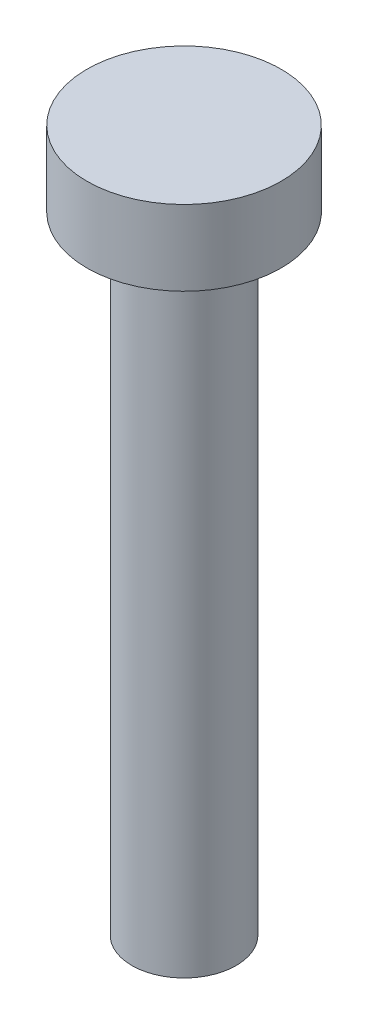
ISO-10303-21;
HEADER;
FILE_DESCRIPTION(('STEP AP214'),'2;1');
FILE_NAME('part.step','',(''),(''),'','','');
FILE_SCHEMA(('AUTOMOTIVE_DESIGN { 1 0 10303 214 1 1 1 1 }'));
ENDSEC;
DATA;
#1=APPLICATION_CONTEXT('core data for automotive mechanical design processes');
#2=APPLICATION_PROTOCOL_DEFINITION('international standard','automotive_design',2000,#1);
#3=PRODUCT_CONTEXT('',#1,'mechanical');
#4=PRODUCT('Part','Part','',(#3));
#5=PRODUCT_RELATED_PRODUCT_CATEGORY('part','',(#4));
#6=PRODUCT_DEFINITION_FORMATION('','',#4);
#7=PRODUCT_DEFINITION_CONTEXT('part definition',#1,'design');
#8=PRODUCT_DEFINITION('design','',#6,#7);
#9=PRODUCT_DEFINITION_SHAPE('','',#8);
#10=(LENGTH_UNIT() NAMED_UNIT(*) SI_UNIT(.MILLI.,.METRE.));
#11=(NAMED_UNIT(*) PLANE_ANGLE_UNIT() SI_UNIT($,.RADIAN.));
#12=(NAMED_UNIT(*) SI_UNIT($,.STERADIAN.) SOLID_ANGLE_UNIT());
#13=UNCERTAINTY_MEASURE_WITH_UNIT(LENGTH_MEASURE(1.E-05),#10,'distance_accuracy_value','');
#14=(GEOMETRIC_REPRESENTATION_CONTEXT(3) GLOBAL_UNCERTAINTY_ASSIGNED_CONTEXT((#13)) GLOBAL_UNIT_ASSIGNED_CONTEXT((#10,
#11,#12)) REPRESENTATION_CONTEXT('',''));
#15=CARTESIAN_POINT('',(0.,0.,0.));
#16=DIRECTION('',(0.,0.,1.));
#17=DIRECTION('',(1.,0.,0.));
#18=AXIS2_PLACEMENT_3D('',#15,#16,#17);
#19=CARTESIAN_POINT('',(0.,30.,0.));
#20=DIRECTION('',(0.,-1.,0.));
#21=DIRECTION('',(0.,0.,-1.));
#22=AXIS2_PLACEMENT_3D('',#19,#20,#21);
#23=CYLINDRICAL_SURFACE('',#22,2.5);
#24=CARTESIAN_POINT('',(0.,30.,0.));
#25=DIRECTION('',(0.,1.,0.));
#26=DIRECTION('',(0.,0.,1.));
#27=AXIS2_PLACEMENT_3D('',#24,#25,#26);
#28=CIRCLE('',#27,2.5);
#29=CARTESIAN_POINT('',(0.,30.,2.5));
#30=VERTEX_POINT('',#29);
#31=EDGE_CURVE('E10',#30,#30,#28,.T.);
#32=ORIENTED_EDGE('',*,*,#31,.F.);
#33=EDGE_LOOP('',(#32));
#34=FACE_BOUND('',#33,.T.);
#35=CARTESIAN_POINT('',(0.,0.,0.));
#36=DIRECTION('',(0.,1.,0.));
#37=DIRECTION('',(0.,0.,1.));
#38=AXIS2_PLACEMENT_3D('',#35,#36,#37);
#39=CIRCLE('',#38,2.5);
#40=CARTESIAN_POINT('',(0.,0.,2.5));
#41=VERTEX_POINT('',#40);
#42=EDGE_CURVE('E40',#41,#41,#39,.T.);
#43=ORIENTED_EDGE('',*,*,#42,.T.);
#44=EDGE_LOOP('',(#43));
#45=FACE_BOUND('',#44,.T.);
#46=ADVANCED_FACE('F37',(#34,#45),#23,.T.);
#47=CARTESIAN_POINT('',(0.,0.,0.));
#48=DIRECTION('',(0.,1.,0.));
#49=DIRECTION('',(0.,0.,1.));
#50=AXIS2_PLACEMENT_3D('',#47,#48,#49);
#51=PLANE('',#50);
#52=ORIENTED_EDGE('',*,*,#42,.F.);
#53=EDGE_LOOP('',(#52));
#54=FACE_BOUND('',#53,.T.);
#55=ADVANCED_FACE('F64',(#54),#51,.F.);
#56=CARTESIAN_POINT('',(0.,33.6,0.));
#57=DIRECTION('',(0.,-1.,0.));
#58=DIRECTION('',(0.,0.,-1.));
#59=AXIS2_PLACEMENT_3D('',#56,#57,#58);
#60=CYLINDRICAL_SURFACE('',#59,4.65);
#61=CARTESIAN_POINT('',(0.,33.6,0.));
#62=DIRECTION('',(0.,1.,0.));
#63=DIRECTION('',(0.,0.,1.));
#64=AXIS2_PLACEMENT_3D('',#61,#62,#63);
#65=CIRCLE('',#64,4.65);
#66=CARTESIAN_POINT('',(0.,33.6,4.65));
#67=VERTEX_POINT('',#66);
#68=EDGE_CURVE('E49',#67,#67,#65,.T.);
#69=ORIENTED_EDGE('',*,*,#68,.F.);
#70=EDGE_LOOP('',(#69));
#71=FACE_BOUND('',#70,.T.);
#72=CARTESIAN_POINT('',(0.,30.,0.));
#73=DIRECTION('',(0.,1.,0.));
#74=DIRECTION('',(0.,0.,1.));
#75=AXIS2_PLACEMENT_3D('',#72,#73,#74);
#76=CIRCLE('',#75,4.65);
#77=CARTESIAN_POINT('',(0.,30.,4.65));
#78=VERTEX_POINT('',#77);
#79=EDGE_CURVE('E51',#78,#78,#76,.T.);
#80=ORIENTED_EDGE('',*,*,#79,.T.);
#81=EDGE_LOOP('',(#80));
#82=FACE_BOUND('',#81,.T.);
#83=ADVANCED_FACE('F61',(#71,#82),#60,.T.);
#84=CARTESIAN_POINT('',(0.,33.6,0.));
#85=DIRECTION('',(0.,1.,0.));
#86=DIRECTION('',(0.,0.,1.));
#87=AXIS2_PLACEMENT_3D('',#84,#85,#86);
#88=PLANE('',#87);
#89=ORIENTED_EDGE('',*,*,#68,.T.);
#90=EDGE_LOOP('',(#89));
#91=FACE_BOUND('',#90,.T.);
#92=ADVANCED_FACE('F59',(#91),#88,.T.);
#93=CARTESIAN_POINT('',(0.,30.,0.));
#94=DIRECTION('',(0.,1.,0.));
#95=DIRECTION('',(0.,0.,1.));
#96=AXIS2_PLACEMENT_3D('',#93,#94,#95);
#97=PLANE('',#96);
#98=ORIENTED_EDGE('',*,*,#31,.T.);
#99=EDGE_LOOP('',(#98));
#100=FACE_BOUND('',#99,.T.);
#101=ORIENTED_EDGE('',*,*,#79,.F.);
#102=EDGE_LOOP('',(#101));
#103=FACE_BOUND('',#102,.T.);
#104=ADVANCED_FACE('F68',(#100,#103),#97,.F.);
#105=CLOSED_SHELL('',(#46,#55,#83,#92,#104));
#106=MANIFOLD_SOLID_BREP('B2',#105);
#107=ADVANCED_BREP_SHAPE_REPRESENTATION('',(#18,#106),#14);
#108=SHAPE_DEFINITION_REPRESENTATION(#9,#107);
ENDSEC;
END-ISO-10303-21;
